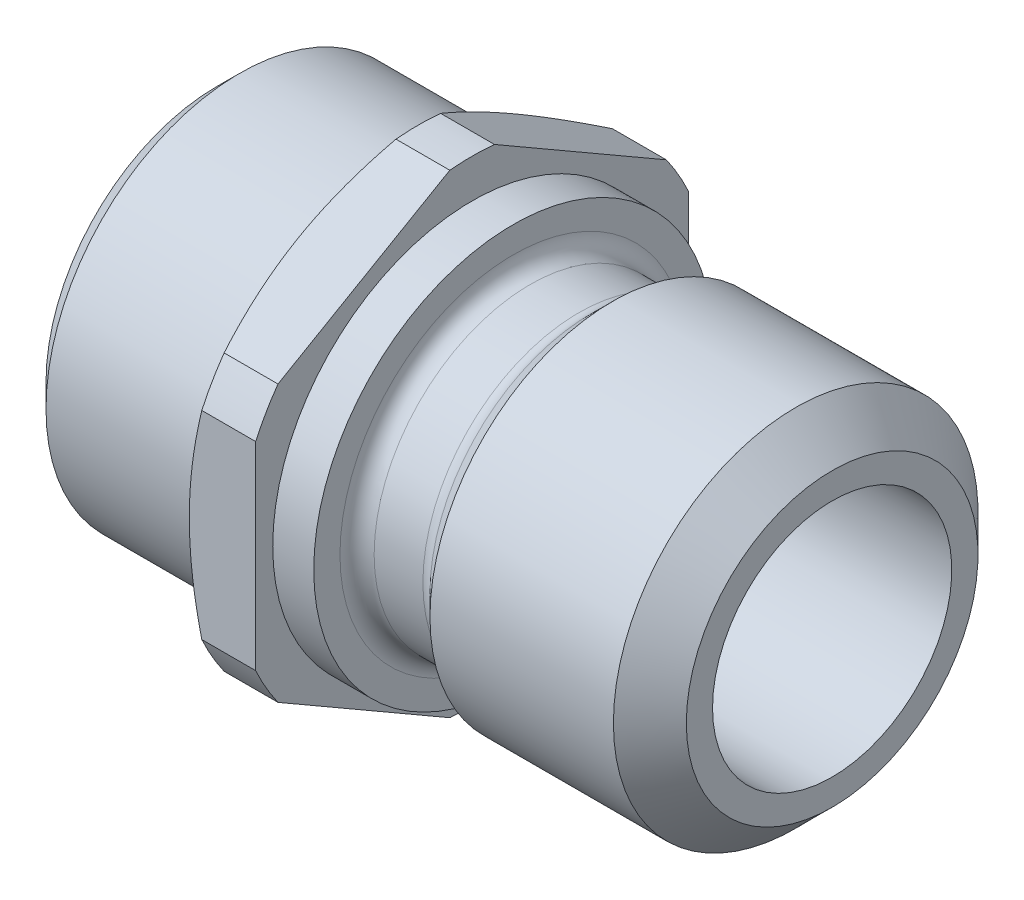
ISO-10303-21;
HEADER;
FILE_DESCRIPTION(('STEP AP214'),'2;1');
FILE_NAME('part.step','',(''),(''),'','','');
FILE_SCHEMA(('AUTOMOTIVE_DESIGN { 1 0 10303 214 1 1 1 1 }'));
ENDSEC;
DATA;
#1=APPLICATION_CONTEXT('core data for automotive mechanical design processes');
#2=APPLICATION_PROTOCOL_DEFINITION('international standard','automotive_design',2000,#1);
#3=PRODUCT_CONTEXT('',#1,'mechanical');
#4=PRODUCT('Part','Part','',(#3));
#5=PRODUCT_RELATED_PRODUCT_CATEGORY('part','',(#4));
#6=PRODUCT_DEFINITION_FORMATION('','',#4);
#7=PRODUCT_DEFINITION_CONTEXT('part definition',#1,'design');
#8=PRODUCT_DEFINITION('design','',#6,#7);
#9=PRODUCT_DEFINITION_SHAPE('','',#8);
#10=(LENGTH_UNIT() NAMED_UNIT(*) SI_UNIT(.MILLI.,.METRE.));
#11=(NAMED_UNIT(*) PLANE_ANGLE_UNIT() SI_UNIT($,.RADIAN.));
#12=(NAMED_UNIT(*) SI_UNIT($,.STERADIAN.) SOLID_ANGLE_UNIT());
#13=UNCERTAINTY_MEASURE_WITH_UNIT(LENGTH_MEASURE(1.E-05),#10,'distance_accuracy_value','');
#14=(GEOMETRIC_REPRESENTATION_CONTEXT(3) GLOBAL_UNCERTAINTY_ASSIGNED_CONTEXT((#13)) GLOBAL_UNIT_ASSIGNED_CONTEXT((#10,
#11,#12)) REPRESENTATION_CONTEXT('',''));
#15=CARTESIAN_POINT('',(0.,0.,0.));
#16=DIRECTION('',(0.,0.,1.));
#17=DIRECTION('',(1.,0.,0.));
#18=AXIS2_PLACEMENT_3D('',#15,#16,#17);
#19=CARTESIAN_POINT('',(0.,0.,0.));
#20=DIRECTION('',(-1.,0.,0.));
#21=DIRECTION('',(0.,0.,1.));
#22=AXIS2_PLACEMENT_3D('',#19,#20,#21);
#23=CYLINDRICAL_SURFACE('',#22,10.45);
#24=CARTESIAN_POINT('',(11.2,0.,0.));
#25=DIRECTION('',(1.,0.,0.));
#26=DIRECTION('',(0.,0.,-1.));
#27=AXIS2_PLACEMENT_3D('',#24,#25,#26);
#28=CIRCLE('',#27,10.45);
#29=CARTESIAN_POINT('',(11.2,10.4039647910562,-0.979804381732968));
#30=VERTEX_POINT('',#29);
#31=CARTESIAN_POINT('',(11.2,10.4039647910562,0.979804381732963));
#32=VERTEX_POINT('',#31);
#33=EDGE_CURVE('E56',#30,#32,#28,.T.);
#34=ORIENTED_EDGE('',*,*,#33,.F.);
#35=DIRECTION('',(-1.,0.,0.));
#36=VECTOR('',#35,1.);
#37=CARTESIAN_POINT('',(0.,10.4039647910562,-0.979804381732969));
#38=LINE('',#37,#36);
#39=CARTESIAN_POINT('',(8.83715789032495,10.4039647910562,-0.979804381732968));
#40=VERTEX_POINT('',#39);
#41=EDGE_CURVE('E410',#40,#30,#38,.F.);
#42=ORIENTED_EDGE('',*,*,#41,.F.);
#43=CARTESIAN_POINT('',(8.83715789032495,0.,0.));
#44=DIRECTION('',(1.,0.,0.));
#45=DIRECTION('',(0.,0.,-1.));
#46=AXIS2_PLACEMENT_3D('',#43,#44,#45);
#47=CIRCLE('',#46,10.45);
#48=CARTESIAN_POINT('',(8.83715789032495,10.4039647910562,0.979804381732963));
#49=VERTEX_POINT('',#48);
#50=EDGE_CURVE('E369',#49,#40,#47,.F.);
#51=ORIENTED_EDGE('',*,*,#50,.F.);
#52=DIRECTION('',(-1.,0.,0.));
#53=VECTOR('',#52,1.);
#54=CARTESIAN_POINT('',(0.,10.4039647910562,0.979804381732963));
#55=LINE('',#54,#53);
#56=EDGE_CURVE('E145',#32,#49,#55,.T.);
#57=ORIENTED_EDGE('',*,*,#56,.F.);
#58=EDGE_LOOP('',(#34,#42,#51,#57));
#59=FACE_BOUND('',#58,.T.);
#60=ADVANCED_FACE('F41',(#59),#23,.T.);
#61=CARTESIAN_POINT('',(11.2,0.,0.));
#62=DIRECTION('',(1.,0.,0.));
#63=DIRECTION('',(0.,0.,-1.));
#64=AXIS2_PLACEMENT_3D('',#61,#62,#63);
#65=CIRCLE('',#64,10.45);
#66=CARTESIAN_POINT('',(11.2,6.05051788084815,8.52019561826704));
#67=VERTEX_POINT('',#66);
#68=CARTESIAN_POINT('',(11.2,4.35344691020805,9.5));
#69=VERTEX_POINT('',#68);
#70=EDGE_CURVE('E131',#67,#69,#65,.T.);
#71=ORIENTED_EDGE('',*,*,#70,.F.);
#72=DIRECTION('',(-1.,0.,0.));
#73=VECTOR('',#72,1.);
#74=CARTESIAN_POINT('',(0.,6.05051788084815,8.52019561826704));
#75=LINE('',#74,#73);
#76=CARTESIAN_POINT('',(8.83715789032495,6.05051788084815,8.52019561826704));
#77=VERTEX_POINT('',#76);
#78=EDGE_CURVE('E140',#77,#67,#75,.F.);
#79=ORIENTED_EDGE('',*,*,#78,.F.);
#80=CARTESIAN_POINT('',(8.83715789032495,0.,0.));
#81=DIRECTION('',(1.,0.,0.));
#82=DIRECTION('',(0.,0.,-1.));
#83=AXIS2_PLACEMENT_3D('',#80,#81,#82);
#84=CIRCLE('',#83,10.45);
#85=CARTESIAN_POINT('',(8.83715789032495,4.35344691020805,9.5));
#86=VERTEX_POINT('',#85);
#87=EDGE_CURVE('E63',#86,#77,#84,.F.);
#88=ORIENTED_EDGE('',*,*,#87,.F.);
#89=DIRECTION('',(-1.,0.,0.));
#90=VECTOR('',#89,1.);
#91=CARTESIAN_POINT('',(0.,4.35344691020805,9.5));
#92=LINE('',#91,#90);
#93=EDGE_CURVE('E141',#69,#86,#92,.T.);
#94=ORIENTED_EDGE('',*,*,#93,.F.);
#95=EDGE_LOOP('',(#71,#79,#88,#94));
#96=FACE_BOUND('',#95,.T.);
#97=ADVANCED_FACE('F139',(#96),#23,.T.);
#98=CARTESIAN_POINT('',(11.2,0.,0.));
#99=DIRECTION('',(1.,0.,0.));
#100=DIRECTION('',(0.,0.,-1.));
#101=AXIS2_PLACEMENT_3D('',#98,#99,#100);
#102=CIRCLE('',#101,10.45);
#103=CARTESIAN_POINT('',(11.2,-4.35344691020839,9.5));
#104=VERTEX_POINT('',#103);
#105=CARTESIAN_POINT('',(11.2,-6.05051788084814,8.52019561826705));
#106=VERTEX_POINT('',#105);
#107=EDGE_CURVE('E393',#104,#106,#102,.T.);
#108=ORIENTED_EDGE('',*,*,#107,.F.);
#109=DIRECTION('',(-1.,0.,0.));
#110=VECTOR('',#109,1.);
#111=CARTESIAN_POINT('',(0.,-4.35344691020806,9.5));
#112=LINE('',#111,#110);
#113=CARTESIAN_POINT('',(8.83715789032466,-4.35344691020839,9.5));
#114=VERTEX_POINT('',#113);
#115=EDGE_CURVE('E149',#114,#104,#112,.F.);
#116=ORIENTED_EDGE('',*,*,#115,.F.);
#117=CARTESIAN_POINT('',(8.83715789032495,0.,0.));
#118=DIRECTION('',(1.,0.,0.));
#119=DIRECTION('',(0.,0.,-1.));
#120=AXIS2_PLACEMENT_3D('',#117,#118,#119);
#121=CIRCLE('',#120,10.45);
#122=CARTESIAN_POINT('',(8.83715789032495,-6.05051788084814,8.52019561826704));
#123=VERTEX_POINT('',#122);
#124=EDGE_CURVE('E253',#123,#114,#121,.F.);
#125=ORIENTED_EDGE('',*,*,#124,.F.);
#126=DIRECTION('',(-1.,0.,0.));
#127=VECTOR('',#126,1.);
#128=CARTESIAN_POINT('',(0.,-6.05051788084814,8.52019561826704));
#129=LINE('',#128,#127);
#130=EDGE_CURVE('E392',#106,#123,#129,.T.);
#131=ORIENTED_EDGE('',*,*,#130,.F.);
#132=EDGE_LOOP('',(#108,#116,#125,#131));
#133=FACE_BOUND('',#132,.T.);
#134=ADVANCED_FACE('F289',(#133),#23,.T.);
#135=CARTESIAN_POINT('',(11.2,0.,0.));
#136=DIRECTION('',(1.,0.,0.));
#137=DIRECTION('',(0.,0.,-1.));
#138=AXIS2_PLACEMENT_3D('',#135,#136,#137);
#139=CIRCLE('',#138,10.45);
#140=CARTESIAN_POINT('',(11.2,-10.4039647910562,0.979804381732949));
#141=VERTEX_POINT('',#140);
#142=CARTESIAN_POINT('',(11.2,-10.4039647910562,-0.979804381732964));
#143=VERTEX_POINT('',#142);
#144=EDGE_CURVE('E372',#141,#143,#139,.T.);
#145=ORIENTED_EDGE('',*,*,#144,.F.);
#146=DIRECTION('',(-1.,0.,0.));
#147=VECTOR('',#146,1.);
#148=CARTESIAN_POINT('',(0.,-10.4039647910562,0.979804381732949));
#149=LINE('',#148,#147);
#150=CARTESIAN_POINT('',(8.83715789032495,-10.4039647910562,0.979804381732949));
#151=VERTEX_POINT('',#150);
#152=EDGE_CURVE('E394',#151,#141,#149,.F.);
#153=ORIENTED_EDGE('',*,*,#152,.F.);
#154=CARTESIAN_POINT('',(8.83715789032495,0.,0.));
#155=DIRECTION('',(1.,0.,0.));
#156=DIRECTION('',(0.,0.,-1.));
#157=AXIS2_PLACEMENT_3D('',#154,#155,#156);
#158=CIRCLE('',#157,10.45);
#159=CARTESIAN_POINT('',(8.83715789032495,-10.4039647910562,-0.979804381732963));
#160=VERTEX_POINT('',#159);
#161=EDGE_CURVE('E413',#160,#151,#158,.F.);
#162=ORIENTED_EDGE('',*,*,#161,.F.);
#163=DIRECTION('',(-1.,0.,0.));
#164=VECTOR('',#163,1.);
#165=CARTESIAN_POINT('',(0.,-10.4039647910562,-0.979804381732964));
#166=LINE('',#165,#164);
#167=EDGE_CURVE('E399',#143,#160,#166,.T.);
#168=ORIENTED_EDGE('',*,*,#167,.F.);
#169=EDGE_LOOP('',(#145,#153,#162,#168));
#170=FACE_BOUND('',#169,.T.);
#171=ADVANCED_FACE('F443',(#170),#23,.T.);
#172=CARTESIAN_POINT('',(11.2,0.,0.));
#173=DIRECTION('',(1.,0.,0.));
#174=DIRECTION('',(0.,0.,-1.));
#175=AXIS2_PLACEMENT_3D('',#172,#173,#174);
#176=CIRCLE('',#175,10.45);
#177=CARTESIAN_POINT('',(11.2,-6.05051788084815,-8.52019561826704));
#178=VERTEX_POINT('',#177);
#179=CARTESIAN_POINT('',(11.2,-4.35344691020838,-9.5));
#180=VERTEX_POINT('',#179);
#181=EDGE_CURVE('E437',#178,#180,#176,.T.);
#182=ORIENTED_EDGE('',*,*,#181,.F.);
#183=DIRECTION('',(-1.,0.,0.));
#184=VECTOR('',#183,1.);
#185=CARTESIAN_POINT('',(0.,-6.05051788084815,-8.52019561826704));
#186=LINE('',#185,#184);
#187=CARTESIAN_POINT('',(8.83715789032495,-6.05051788084815,-8.52019561826704));
#188=VERTEX_POINT('',#187);
#189=EDGE_CURVE('E401',#188,#178,#186,.F.);
#190=ORIENTED_EDGE('',*,*,#189,.F.);
#191=CARTESIAN_POINT('',(8.83715789032495,0.,0.));
#192=DIRECTION('',(1.,0.,0.));
#193=DIRECTION('',(0.,0.,-1.));
#194=AXIS2_PLACEMENT_3D('',#191,#192,#193);
#195=CIRCLE('',#194,10.45);
#196=CARTESIAN_POINT('',(8.83715789032465,-4.35344691020838,-9.5));
#197=VERTEX_POINT('',#196);
#198=EDGE_CURVE('E416',#197,#188,#195,.F.);
#199=ORIENTED_EDGE('',*,*,#198,.F.);
#200=DIRECTION('',(-1.,0.,0.));
#201=VECTOR('',#200,1.);
#202=CARTESIAN_POINT('',(0.,-4.35344691020804,-9.5));
#203=LINE('',#202,#201);
#204=EDGE_CURVE('E404',#180,#197,#203,.T.);
#205=ORIENTED_EDGE('',*,*,#204,.F.);
#206=EDGE_LOOP('',(#182,#190,#199,#205));
#207=FACE_BOUND('',#206,.T.);
#208=ADVANCED_FACE('F280',(#207),#23,.T.);
#209=CARTESIAN_POINT('',(11.2,0.,0.));
#210=DIRECTION('',(1.,0.,0.));
#211=DIRECTION('',(0.,0.,-1.));
#212=AXIS2_PLACEMENT_3D('',#209,#210,#211);
#213=CIRCLE('',#212,10.45);
#214=CARTESIAN_POINT('',(11.2,4.35344691020804,-9.5));
#215=VERTEX_POINT('',#214);
#216=CARTESIAN_POINT('',(11.2,6.05051788084815,-8.52019561826703));
#217=VERTEX_POINT('',#216);
#218=EDGE_CURVE('E424',#215,#217,#213,.T.);
#219=ORIENTED_EDGE('',*,*,#218,.F.);
#220=DIRECTION('',(-1.,0.,0.));
#221=VECTOR('',#220,1.);
#222=CARTESIAN_POINT('',(0.,4.35344691020804,-9.5));
#223=LINE('',#222,#221);
#224=CARTESIAN_POINT('',(8.83715789032495,4.35344691020804,-9.5));
#225=VERTEX_POINT('',#224);
#226=EDGE_CURVE('E406',#225,#215,#223,.F.);
#227=ORIENTED_EDGE('',*,*,#226,.F.);
#228=CARTESIAN_POINT('',(8.83715789032495,0.,0.));
#229=DIRECTION('',(1.,0.,0.));
#230=DIRECTION('',(0.,0.,-1.));
#231=AXIS2_PLACEMENT_3D('',#228,#229,#230);
#232=CIRCLE('',#231,10.45);
#233=CARTESIAN_POINT('',(8.83715789032495,6.05051788084815,-8.52019561826703));
#234=VERTEX_POINT('',#233);
#235=EDGE_CURVE('E382',#234,#225,#232,.F.);
#236=ORIENTED_EDGE('',*,*,#235,.F.);
#237=DIRECTION('',(-1.,0.,0.));
#238=VECTOR('',#237,1.);
#239=CARTESIAN_POINT('',(0.,6.05051788084815,-8.52019561826703));
#240=LINE('',#239,#238);
#241=EDGE_CURVE('E409',#217,#234,#240,.T.);
#242=ORIENTED_EDGE('',*,*,#241,.F.);
#243=EDGE_LOOP('',(#219,#227,#236,#242));
#244=FACE_BOUND('',#243,.T.);
#245=ADVANCED_FACE('F275',(#244),#23,.T.);
#246=CARTESIAN_POINT('',(27.,10.9696551146029,0.));
#247=DIRECTION('',(0.,0.866025403784439,-0.5));
#248=DIRECTION('',(0.,0.5,0.866025403784439));
#249=AXIS2_PLACEMENT_3D('',#246,#247,#248);
#250=PLANE('',#249);
#251=ORIENTED_EDGE('',*,*,#41,.T.);
#252=DIRECTION('',(0.,-0.5,-0.866025403784439));
#253=VECTOR('',#252,1.);
#254=CARTESIAN_POINT('',(11.2,10.9696551146029,0.));
#255=LINE('',#254,#253);
#256=EDGE_CURVE('E425',#30,#217,#255,.T.);
#257=ORIENTED_EDGE('',*,*,#256,.T.);
#258=ORIENTED_EDGE('',*,*,#241,.T.);
#259=CARTESIAN_POINT('',(8.83721343791461,6.05040241079431,-8.52039561826704));
#260=CARTESIAN_POINT('',(8.78130752598836,6.16660308278487,-8.31913015050574));
#261=CARTESIAN_POINT('',(8.72890160018437,6.28323858344694,-8.11711153739281));
#262=CARTESIAN_POINT('',(8.63186121008157,6.51734897750982,-7.71162044029593));
#263=CARTESIAN_POINT('',(8.58722905266259,6.63482410934285,-7.50814754333527));
#264=CARTESIAN_POINT('',(8.50649562043556,6.8706493065652,-7.09968632004121));
#265=CARTESIAN_POINT('',(8.47040415720236,6.98900021870154,-6.89469652709895));
#266=CARTESIAN_POINT('',(8.40754027399902,7.22631093928369,-6.48366230186988));
#267=CARTESIAN_POINT('',(8.38076692333464,7.34527068571404,-6.277617976997));
#268=CARTESIAN_POINT('',(8.33755024671181,7.58132241724473,-5.86876438477125));
#269=CARTESIAN_POINT('',(8.32091568920526,7.69840559622127,-5.66597037007219));
#270=CARTESIAN_POINT('',(8.2975472390332,7.93281817105879,-5.25995588052056));
#271=CARTESIAN_POINT('',(8.29081314579958,8.05014756188367,-5.05673541439076));
#272=CARTESIAN_POINT('',(8.28740609012631,8.28475679751206,-4.65038029835749));
#273=CARTESIAN_POINT('',(8.29072571865206,8.40203661513028,-4.44724569554032));
#274=CARTESIAN_POINT('',(8.3073296572061,8.63640953569672,-4.04129988920094));
#275=CARTESIAN_POINT('',(8.32061326069902,8.75350265129386,-3.83848866377017));
#276=CARTESIAN_POINT('',(8.3586400326737,8.99893295038956,-3.4133909160196));
#277=CARTESIAN_POINT('',(8.38439088606164,9.1272310754818,-3.19117204484399));
#278=CARTESIAN_POINT('',(8.44689653444807,9.38316198259074,-2.74788671050412));
#279=CARTESIAN_POINT('',(8.48365236553387,9.51079470080966,-2.52682035784084));
#280=CARTESIAN_POINT('',(8.56776048854812,9.7666310971655,-2.08369872092719));
#281=CARTESIAN_POINT('',(8.61522583902933,9.89482539507275,-1.86165968371122));
#282=CARTESIAN_POINT('',(8.71948038376729,10.1502131430836,-1.41931512852586));
#283=CARTESIAN_POINT('',(8.77626590739831,10.277406966627,-1.19900896373964));
#284=CARTESIAN_POINT('',(8.83721343791461,10.40408026111,-0.979604381732966));
#285=B_SPLINE_CURVE_WITH_KNOTS('',3,(#259,#260,#261,#262,#263,#264,#265,#266,#267,#268,#269,
#270,#271,#272,#273,#274,#275,#276,#277,#278,#279,#280,#281,#282,#283,#284),.UNSPECIFIED.,.F.,
.F.,(4,2,2,2,2,2,2,2,2,2,2,2,4),(0.,0.717106261326527,1.43442496400457,2.1525637668942,
2.87063082139254,3.57469737526868,4.27874966564865,4.98228323487405,5.68576692196095,
6.45916499644672,7.2326359070674,8.01468969739446,8.79643622210647),.UNSPECIFIED.);
#286=EDGE_CURVE('E238',#234,#40,#285,.T.);
#287=ORIENTED_EDGE('',*,*,#286,.T.);
#288=EDGE_LOOP('',(#251,#257,#258,#287));
#289=FACE_BOUND('',#288,.T.);
#290=ADVANCED_FACE('F271',(#289),#250,.T.);
#291=CARTESIAN_POINT('',(27.,5.48482755730145,-9.5));
#292=DIRECTION('',(0.,0.,-1.));
#293=DIRECTION('',(-1.,0.,0.));
#294=AXIS2_PLACEMENT_3D('',#291,#292,#293);
#295=PLANE('',#294);
#296=ORIENTED_EDGE('',*,*,#226,.T.);
#297=DIRECTION('',(0.,-1.,0.));
#298=VECTOR('',#297,1.);
#299=CARTESIAN_POINT('',(11.2,5.48482755730145,-9.5));
#300=LINE('',#299,#298);
#301=EDGE_CURVE('E435',#215,#180,#300,.T.);
#302=ORIENTED_EDGE('',*,*,#301,.T.);
#303=ORIENTED_EDGE('',*,*,#204,.T.);
#304=CARTESIAN_POINT('',(12.0995464742129,-12.9992328214621,-9.5));
#305=CARTESIAN_POINT('',(12.0097464171585,-12.8065813098101,-9.5));
#306=CARTESIAN_POINT('',(11.9205136254968,-12.6136655440469,-9.5));
#307=CARTESIAN_POINT('',(11.7433090322967,-12.2272527408477,-9.5));
#308=CARTESIAN_POINT('',(11.6553372478138,-12.0337556955924,-9.5));
#309=CARTESIAN_POINT('',(11.3934719740346,-11.4522441558293,-9.5));
#310=CARTESIAN_POINT('',(11.2216644162951,-11.0632859134566,-9.5));
#311=CARTESIAN_POINT('',(10.8838821861119,-10.2800341150729,-9.5));
#312=CARTESIAN_POINT('',(10.7179492591235,-9.88572250409203,-9.5));
#313=CARTESIAN_POINT('',(10.3947337955923,-9.09358068006351,-9.5));
#314=CARTESIAN_POINT('',(10.2374507554252,-8.69575067343712,-9.5));
#315=CARTESIAN_POINT('',(9.93358515832042,-7.89559292229277,-9.5));
#316=CARTESIAN_POINT('',(9.78701230061235,-7.49326147224343,-9.5));
#317=CARTESIAN_POINT('',(9.50752756847527,-6.68380291788842,-9.5));
#318=CARTESIAN_POINT('',(9.37461697388036,-6.27667536827504,-9.5));
#319=CARTESIAN_POINT('',(9.12629019442572,-5.45809131334874,-9.5));
#320=CARTESIAN_POINT('',(9.01083409580538,-5.0466470580525,-9.5));
#321=CARTESIAN_POINT('',(8.80124639694947,-4.21839824467654,-9.5));
#322=CARTESIAN_POINT('',(8.70711036954019,-3.80159481847562,-9.5));
#323=CARTESIAN_POINT('',(8.53878439408632,-2.9321881346465,-9.5));
#324=CARTESIAN_POINT('',(8.46655270787129,-2.47919304175795,-9.5));
#325=CARTESIAN_POINT('',(8.38440732879174,-1.7965699066059,-9.5));
#326=CARTESIAN_POINT('',(8.36139119518645,-1.56847545760395,-9.5));
#327=CARTESIAN_POINT('',(8.32454890423239,-1.1115493898491,-9.5));
#328=CARTESIAN_POINT('',(8.31072202609125,-0.882717830329301,-9.5));
#329=CARTESIAN_POINT('',(8.29259620626157,-0.425403364557788,-9.5));
#330=CARTESIAN_POINT('',(8.2882672290769,-0.196921649183438,-9.5));
#331=CARTESIAN_POINT('',(8.2891435329354,0.260020963343509,-9.5));
#332=CARTESIAN_POINT('',(8.2943487013467,0.488481860710155,-9.5));
#333=CARTESIAN_POINT('',(8.31417543088754,0.944945707258984,-9.5));
#334=CARTESIAN_POINT('',(8.3287950414353,1.17294874149208,-9.5));
#335=CARTESIAN_POINT('',(8.36712806033476,1.62819335243467,-9.5));
#336=CARTESIAN_POINT('',(8.39084205412586,1.85543487917292,-9.5));
#337=CARTESIAN_POINT('',(8.46285603220757,2.43799887762425,-9.5));
#338=CARTESIAN_POINT('',(8.51746637904825,2.79255171671626,-9.5));
#339=CARTESIAN_POINT('',(8.64551829841406,3.49824695586364,-9.5));
#340=CARTESIAN_POINT('',(8.7189635796423,3.84938867010054,-9.5));
#341=CARTESIAN_POINT('',(8.88216439648538,4.54866427277825,-9.5));
#342=CARTESIAN_POINT('',(8.97195649791692,4.89678954709179,-9.5));
#343=CARTESIAN_POINT('',(9.16511660602808,5.58919802635257,-9.5));
#344=CARTESIAN_POINT('',(9.26848388054421,5.93348143742116,-9.5));
#345=CARTESIAN_POINT('',(9.48833782174317,6.62432935036751,-9.5));
#346=CARTESIAN_POINT('',(9.60501937490252,6.97083142090083,-9.5));
#347=CARTESIAN_POINT('',(9.84795357638832,7.66047582773158,-9.5));
#348=CARTESIAN_POINT('',(9.97420696706235,8.00361790110802,-9.5));
#349=CARTESIAN_POINT('',(10.2337755180427,8.68485629595352,-9.5));
#350=CARTESIAN_POINT('',(10.3670439491386,9.02297051846725,-9.5));
#351=CARTESIAN_POINT('',(10.6399827892818,9.69649101514693,-9.5));
#352=CARTESIAN_POINT('',(10.779651256238,10.0318980749391,-9.5));
#353=CARTESIAN_POINT('',(10.9218882356006,10.3661831157756,-9.5));
#354=B_SPLINE_CURVE_WITH_KNOTS('',3,(#304,#305,#306,#307,#308,#309,#310,#311,#312,#313,#314,
#315,#316,#317,#318,#319,#320,#321,#322,#323,#324,#325,#326,#327,#328,#329,#330,#331,#332,#333,
#334,#335,#336,#337,#338,#339,#340,#341,#342,#343,#344,#345,#346,#347,#348,#349,#350,#351,#352,
#353),.UNSPECIFIED.,.F.,.F.,(4,2,2,2,2,2,2,2,2,2,2,2,2,2,2,2,2,2,2,2,2,2,2,2,4),(0.,
0.637656420898983,1.27532145813519,2.55090538876409,3.83423366173366,5.11748713590538,
6.40188869068364,7.68641045437004,8.96794892276126,10.2492210315362,11.6240468119757,
12.3116492760261,12.999197799132,13.6845689140796,14.3699319324307,15.0551529958312,
15.7404181768778,16.8159965340668,17.8917868414349,18.970013805859,20.0481826410464,
21.1448749147107,22.2416523299494,23.3318729411822,24.4217648878422),.UNSPECIFIED.);
#355=EDGE_CURVE('E252',#197,#225,#354,.T.);
#356=ORIENTED_EDGE('',*,*,#355,.T.);
#357=EDGE_LOOP('',(#296,#302,#303,#356));
#358=FACE_BOUND('',#357,.T.);
#359=ADVANCED_FACE('F267',(#358),#295,.T.);
#360=CARTESIAN_POINT('',(27.,-5.48482755730145,-9.5));
#361=DIRECTION('',(0.,-0.866025403784439,-0.5));
#362=DIRECTION('',(0.,0.5,-0.866025403784439));
#363=AXIS2_PLACEMENT_3D('',#360,#361,#362);
#364=PLANE('',#363);
#365=ORIENTED_EDGE('',*,*,#189,.T.);
#366=DIRECTION('',(0.,-0.5,0.866025403784439));
#367=VECTOR('',#366,1.);
#368=CARTESIAN_POINT('',(11.2,-5.48482755730145,-9.5));
#369=LINE('',#368,#367);
#370=EDGE_CURVE('E367',#178,#143,#369,.T.);
#371=ORIENTED_EDGE('',*,*,#370,.T.);
#372=ORIENTED_EDGE('',*,*,#167,.T.);
#373=CARTESIAN_POINT('',(8.83721343791461,-10.40408026111,-0.979604381732962));
#374=CARTESIAN_POINT('',(8.78130752598836,-10.2878795891195,-1.18086984949426));
#375=CARTESIAN_POINT('',(8.72890160018437,-10.1712440884574,-1.38288846260719));
#376=CARTESIAN_POINT('',(8.63186121008157,-9.93713369439452,-1.78837955970407));
#377=CARTESIAN_POINT('',(8.58722905266259,-9.81965856256149,-1.99185245666473));
#378=CARTESIAN_POINT('',(8.50649562043556,-9.58383336533914,-2.40031367995879));
#379=CARTESIAN_POINT('',(8.47040415720236,-9.4654824532028,-2.60530347290105));
#380=CARTESIAN_POINT('',(8.40754027399902,-9.22817173262065,-3.01633769813012));
#381=CARTESIAN_POINT('',(8.38076692333464,-9.1092119861903,-3.222382023003));
#382=CARTESIAN_POINT('',(8.33755024671181,-8.87316025465961,-3.63123561522875));
#383=CARTESIAN_POINT('',(8.32091568920526,-8.75607707568307,-3.83402962992781));
#384=CARTESIAN_POINT('',(8.29754723903319,-8.52166450084555,-4.24004411947943));
#385=CARTESIAN_POINT('',(8.29081314579958,-8.40433511002067,-4.44326458560924));
#386=CARTESIAN_POINT('',(8.28740609012631,-8.16972587439228,-4.84961970164251));
#387=CARTESIAN_POINT('',(8.29072571865206,-8.05244605677406,-5.05275430445968));
#388=CARTESIAN_POINT('',(8.3073296572061,-7.81807313620762,-5.45870011079906));
#389=CARTESIAN_POINT('',(8.32061326069902,-7.70098002061048,-5.66151133622983));
#390=CARTESIAN_POINT('',(8.3586400326737,-7.45554972151478,-6.0866090839804));
#391=CARTESIAN_POINT('',(8.38439088606164,-7.32725159642253,-6.30882795515601));
#392=CARTESIAN_POINT('',(8.44689653444807,-7.07132068931359,-6.75211328949588));
#393=CARTESIAN_POINT('',(8.48365236553387,-6.94368797109468,-6.97317964215916));
#394=CARTESIAN_POINT('',(8.56776048854812,-6.68785157473884,-7.41630127907281));
#395=CARTESIAN_POINT('',(8.61522583902933,-6.55965727683159,-7.63834031628878));
#396=CARTESIAN_POINT('',(8.7194803837673,-6.30426952882076,-8.08068487147414));
#397=CARTESIAN_POINT('',(8.77626590739831,-6.1770757052773,-8.30099103626037));
#398=CARTESIAN_POINT('',(8.83721343791461,-6.05040241079431,-8.52039561826704));
#399=B_SPLINE_CURVE_WITH_KNOTS('',3,(#373,#374,#375,#376,#377,#378,#379,#380,#381,#382,#383,
#384,#385,#386,#387,#388,#389,#390,#391,#392,#393,#394,#395,#396,#397,#398),.UNSPECIFIED.,.F.,
.F.,(4,2,2,2,2,2,2,2,2,2,2,2,4),(0.,0.717106261326527,1.43442496400457,2.15256376689421,
2.87063082139254,3.57469737526869,4.27874966564866,4.98228323487405,5.68576692196095,
6.45916499644672,7.23263590706741,8.01468969739447,8.79643622210648),.UNSPECIFIED.);
#400=EDGE_CURVE('E218',#160,#188,#399,.T.);
#401=ORIENTED_EDGE('',*,*,#400,.T.);
#402=EDGE_LOOP('',(#365,#371,#372,#401));
#403=FACE_BOUND('',#402,.T.);
#404=ADVANCED_FACE('F263',(#403),#364,.T.);
#405=CARTESIAN_POINT('',(27.,-10.9696551146029,0.));
#406=DIRECTION('',(0.,-0.866025403784439,0.5));
#407=DIRECTION('',(0.,-0.5,-0.866025403784439));
#408=AXIS2_PLACEMENT_3D('',#405,#406,#407);
#409=PLANE('',#408);
#410=ORIENTED_EDGE('',*,*,#152,.T.);
#411=DIRECTION('',(0.,0.5,0.866025403784439));
#412=VECTOR('',#411,1.);
#413=CARTESIAN_POINT('',(11.2,-10.9696551146029,0.));
#414=LINE('',#413,#412);
#415=EDGE_CURVE('E427',#141,#106,#414,.T.);
#416=ORIENTED_EDGE('',*,*,#415,.T.);
#417=ORIENTED_EDGE('',*,*,#130,.T.);
#418=CARTESIAN_POINT('',(8.83721343791461,-6.0504024107943,8.52039561826705));
#419=CARTESIAN_POINT('',(8.78130752598836,-6.16660308278486,8.31913015050575));
#420=CARTESIAN_POINT('',(8.72890160018437,-6.28323858344693,8.11711153739282));
#421=CARTESIAN_POINT('',(8.63186121008157,-6.51734897750981,7.71162044029594));
#422=CARTESIAN_POINT('',(8.58722905266259,-6.63482410934284,7.50814754333528));
#423=CARTESIAN_POINT('',(8.50649562043556,-6.87064930656519,7.09968632004122));
#424=CARTESIAN_POINT('',(8.47040415720236,-6.98900021870153,6.89469652709896));
#425=CARTESIAN_POINT('',(8.40754027399901,-7.22631093928368,6.48366230186989));
#426=CARTESIAN_POINT('',(8.38076692333464,-7.34527068571403,6.27761797699701));
#427=CARTESIAN_POINT('',(8.33755024671181,-7.58132241724471,5.86876438477126));
#428=CARTESIAN_POINT('',(8.32091568920526,-7.69840559622126,5.6659703700722));
#429=CARTESIAN_POINT('',(8.29754723903319,-7.93281817105878,5.25995588052058));
#430=CARTESIAN_POINT('',(8.29081314579958,-8.05014756188366,5.05673541439077));
#431=CARTESIAN_POINT('',(8.28740609012631,-8.28475679751205,4.6503802983575));
#432=CARTESIAN_POINT('',(8.29072571865205,-8.40203661513027,4.44724569554034));
#433=CARTESIAN_POINT('',(8.3073296572061,-8.63640953569671,4.04129988920096));
#434=CARTESIAN_POINT('',(8.32061326069901,-8.75350265129385,3.83848866377018));
#435=CARTESIAN_POINT('',(8.3586400326737,-8.99893295038954,3.41339091601961));
#436=CARTESIAN_POINT('',(8.38439088606164,-9.12723107548179,3.191172044844));
#437=CARTESIAN_POINT('',(8.44689653444806,-9.38316198259074,2.74788671050412));
#438=CARTESIAN_POINT('',(8.48365236553387,-9.51079470080965,2.52682035784084));
#439=CARTESIAN_POINT('',(8.56776048854811,-9.7666310971655,2.08369872092719));
#440=CARTESIAN_POINT('',(8.61522583902933,-9.89482539507274,1.86165968371121));
#441=CARTESIAN_POINT('',(8.71948038376729,-10.1502131430836,1.41931512852585));
#442=CARTESIAN_POINT('',(8.77626590739831,-10.277406966627,1.19900896373962));
#443=CARTESIAN_POINT('',(8.83721343791461,-10.40408026111,0.979604381732947));
#444=B_SPLINE_CURVE_WITH_KNOTS('',3,(#418,#419,#420,#421,#422,#423,#424,#425,#426,#427,#428,
#429,#430,#431,#432,#433,#434,#435,#436,#437,#438,#439,#440,#441,#442,#443),.UNSPECIFIED.,.F.,
.F.,(4,2,2,2,2,2,2,2,2,2,2,2,4),(0.,0.717106261326528,1.43442496400457,2.15256376689421,
2.87063082139254,3.57469737526869,4.27874966564865,4.98228323487405,5.68576692196095,
6.45916499644673,7.23263590706742,8.01468969739449,8.7964362221065),.UNSPECIFIED.);
#445=EDGE_CURVE('E245',#123,#151,#444,.T.);
#446=ORIENTED_EDGE('',*,*,#445,.T.);
#447=EDGE_LOOP('',(#410,#416,#417,#446));
#448=FACE_BOUND('',#447,.T.);
#449=ADVANCED_FACE('F260',(#448),#409,.T.);
#450=CARTESIAN_POINT('',(27.,-5.48482755730145,9.5));
#451=DIRECTION('',(0.,0.,1.));
#452=DIRECTION('',(0.,-1.,0.));
#453=AXIS2_PLACEMENT_3D('',#450,#451,#452);
#454=PLANE('',#453);
#455=ORIENTED_EDGE('',*,*,#115,.T.);
#456=DIRECTION('',(0.,1.,0.));
#457=VECTOR('',#456,1.);
#458=CARTESIAN_POINT('',(11.2,-5.48482755730145,9.5));
#459=LINE('',#458,#457);
#460=EDGE_CURVE('E429',#104,#69,#459,.T.);
#461=ORIENTED_EDGE('',*,*,#460,.T.);
#462=ORIENTED_EDGE('',*,*,#93,.T.);
#463=CARTESIAN_POINT('',(12.0995464742129,-12.9992328214621,9.49999999999999));
#464=CARTESIAN_POINT('',(12.0097464171585,-12.8065813098101,9.49999999999999));
#465=CARTESIAN_POINT('',(11.9205136254968,-12.613665544047,9.49999999999999));
#466=CARTESIAN_POINT('',(11.7433090322967,-12.2272527408477,9.49999999999999));
#467=CARTESIAN_POINT('',(11.6553372478138,-12.0337556955924,9.49999999999999));
#468=CARTESIAN_POINT('',(11.3934719740346,-11.4522441558294,9.49999999999999));
#469=CARTESIAN_POINT('',(11.2216644162951,-11.0632859134566,9.5));
#470=CARTESIAN_POINT('',(10.8838821861119,-10.2800341150729,9.5));
#471=CARTESIAN_POINT('',(10.7179492591235,-9.88572250409204,9.5));
#472=CARTESIAN_POINT('',(10.3947337955923,-9.09358068006352,9.5));
#473=CARTESIAN_POINT('',(10.2374507554252,-8.69575067343714,9.5));
#474=CARTESIAN_POINT('',(9.93358515832042,-7.89559292229279,9.5));
#475=CARTESIAN_POINT('',(9.78701230061236,-7.49326147224344,9.5));
#476=CARTESIAN_POINT('',(9.50752756847528,-6.68380291788843,9.5));
#477=CARTESIAN_POINT('',(9.37461697388037,-6.27667536827505,9.5));
#478=CARTESIAN_POINT('',(9.12629019442572,-5.45809131334875,9.5));
#479=CARTESIAN_POINT('',(9.01083409580538,-5.04664705805251,9.5));
#480=CARTESIAN_POINT('',(8.80124639694947,-4.21839824467655,9.5));
#481=CARTESIAN_POINT('',(8.70711036954019,-3.80159481847562,9.5));
#482=CARTESIAN_POINT('',(8.53878439408632,-2.93218813464651,9.5));
#483=CARTESIAN_POINT('',(8.46655270787129,-2.47919304175796,9.5));
#484=CARTESIAN_POINT('',(8.38440732879174,-1.79656990660591,9.5));
#485=CARTESIAN_POINT('',(8.36139119518645,-1.56847545760396,9.5));
#486=CARTESIAN_POINT('',(8.32454890423239,-1.11154938984911,9.5));
#487=CARTESIAN_POINT('',(8.31072202609125,-0.882717830329309,9.5));
#488=CARTESIAN_POINT('',(8.29259620626157,-0.425403364557797,9.5));
#489=CARTESIAN_POINT('',(8.2882672290769,-0.196921649183447,9.5));
#490=CARTESIAN_POINT('',(8.2891435329354,0.2600209633435,9.5));
#491=CARTESIAN_POINT('',(8.2943487013467,0.488481860710146,9.5));
#492=CARTESIAN_POINT('',(8.31417543088754,0.944945707258974,9.5));
#493=CARTESIAN_POINT('',(8.3287950414353,1.17294874149207,9.5));
#494=CARTESIAN_POINT('',(8.36712806033475,1.62819335243466,9.5));
#495=CARTESIAN_POINT('',(8.39084205412586,1.85543487917291,9.5));
#496=CARTESIAN_POINT('',(8.46285603220756,2.43799887762424,9.5));
#497=CARTESIAN_POINT('',(8.51746637904824,2.79255171671625,9.5));
#498=CARTESIAN_POINT('',(8.64551829841406,3.49824695586363,9.5));
#499=CARTESIAN_POINT('',(8.71896357964229,3.84938867010053,9.5));
#500=CARTESIAN_POINT('',(8.88216439648537,4.54866427277824,9.5));
#501=CARTESIAN_POINT('',(8.97195649791692,4.89678954709177,9.5));
#502=CARTESIAN_POINT('',(9.16511660602807,5.58919802635256,9.5));
#503=CARTESIAN_POINT('',(9.2684838805442,5.93348143742115,9.5));
#504=CARTESIAN_POINT('',(9.48833782174316,6.62432935036749,9.5));
#505=CARTESIAN_POINT('',(9.60501937490251,6.97083142090081,9.5));
#506=CARTESIAN_POINT('',(9.84795357638831,7.66047582773157,9.5));
#507=CARTESIAN_POINT('',(9.97420696706234,8.003617901108,9.5));
#508=CARTESIAN_POINT('',(10.2337755180427,8.68485629595351,9.5));
#509=CARTESIAN_POINT('',(10.3670439491386,9.02297051846723,9.5));
#510=CARTESIAN_POINT('',(10.6399827892818,9.69649101514691,9.5));
#511=CARTESIAN_POINT('',(10.779651256238,10.0318980749391,9.5));
#512=CARTESIAN_POINT('',(10.9218882356006,10.3661831157756,9.5));
#513=B_SPLINE_CURVE_WITH_KNOTS('',3,(#463,#464,#465,#466,#467,#468,#469,#470,#471,#472,#473,
#474,#475,#476,#477,#478,#479,#480,#481,#482,#483,#484,#485,#486,#487,#488,#489,#490,#491,#492,
#493,#494,#495,#496,#497,#498,#499,#500,#501,#502,#503,#504,#505,#506,#507,#508,#509,#510,#511,
#512),.UNSPECIFIED.,.F.,.F.,(4,2,2,2,2,2,2,2,2,2,2,2,2,2,2,2,2,2,2,2,2,2,2,2,4),(0.,
0.637656420898984,1.27532145813519,2.55090538876409,3.83423366173366,5.11748713590538,
6.40188869068364,7.68641045437004,8.96794892276126,10.2492210315362,11.6240468119757,
12.3116492760262,12.999197799132,13.6845689140796,14.3699319324307,15.0551529958313,
15.7404181768778,16.8159965340669,17.8917868414349,18.970013805859,20.0481826410464,
21.1448749147107,22.2416523299494,23.3318729411822,24.4217648878422),.UNSPECIFIED.);
#514=EDGE_CURVE('E231',#86,#114,#513,.F.);
#515=ORIENTED_EDGE('',*,*,#514,.T.);
#516=EDGE_LOOP('',(#455,#461,#462,#515));
#517=FACE_BOUND('',#516,.T.);
#518=ADVANCED_FACE('F212',(#517),#454,.T.);
#519=CARTESIAN_POINT('',(27.,5.48482755730145,9.5));
#520=DIRECTION('',(0.,0.866025403784439,0.5));
#521=DIRECTION('',(0.,-0.5,0.866025403784439));
#522=AXIS2_PLACEMENT_3D('',#519,#520,#521);
#523=PLANE('',#522);
#524=ORIENTED_EDGE('',*,*,#78,.T.);
#525=DIRECTION('',(0.,0.5,-0.866025403784439));
#526=VECTOR('',#525,1.);
#527=CARTESIAN_POINT('',(11.2,5.48482755730145,9.5));
#528=LINE('',#527,#526);
#529=EDGE_CURVE('E12',#67,#32,#528,.T.);
#530=ORIENTED_EDGE('',*,*,#529,.T.);
#531=ORIENTED_EDGE('',*,*,#56,.T.);
#532=CARTESIAN_POINT('',(8.83721343791461,10.40408026111,0.979604381732962));
#533=CARTESIAN_POINT('',(8.78130752598836,10.2878795891195,1.18086984949426));
#534=CARTESIAN_POINT('',(8.72890160018437,10.1712440884574,1.38288846260719));
#535=CARTESIAN_POINT('',(8.63186121008157,9.93713369439452,1.78837955970407));
#536=CARTESIAN_POINT('',(8.58722905266259,9.81965856256149,1.99185245666473));
#537=CARTESIAN_POINT('',(8.50649562043556,9.58383336533914,2.40031367995879));
#538=CARTESIAN_POINT('',(8.47040415720236,9.4654824532028,2.60530347290105));
#539=CARTESIAN_POINT('',(8.40754027399902,9.22817173262065,3.01633769813012));
#540=CARTESIAN_POINT('',(8.38076692333464,9.1092119861903,3.222382023003));
#541=CARTESIAN_POINT('',(8.33755024671181,8.87316025465961,3.63123561522875));
#542=CARTESIAN_POINT('',(8.32091568920526,8.75607707568307,3.83402962992781));
#543=CARTESIAN_POINT('',(8.29754723903319,8.52166450084555,4.24004411947944));
#544=CARTESIAN_POINT('',(8.29081314579958,8.40433511002067,4.44326458560924));
#545=CARTESIAN_POINT('',(8.28740609012631,8.16972587439228,4.84961970164251));
#546=CARTESIAN_POINT('',(8.29072571865206,8.05244605677406,5.05275430445968));
#547=CARTESIAN_POINT('',(8.3073296572061,7.81807313620762,5.45870011079906));
#548=CARTESIAN_POINT('',(8.32061326069902,7.70098002061048,5.66151133622983));
#549=CARTESIAN_POINT('',(8.3586400326737,7.45554972151478,6.0866090839804));
#550=CARTESIAN_POINT('',(8.38439088606164,7.32725159642254,6.30882795515601));
#551=CARTESIAN_POINT('',(8.44689653444807,7.0713206893136,6.75211328949588));
#552=CARTESIAN_POINT('',(8.48365236553387,6.94368797109468,6.97317964215916));
#553=CARTESIAN_POINT('',(8.56776048854812,6.68785157473884,7.41630127907281));
#554=CARTESIAN_POINT('',(8.61522583902933,6.55965727683159,7.63834031628878));
#555=CARTESIAN_POINT('',(8.7194803837673,6.30426952882076,8.08068487147414));
#556=CARTESIAN_POINT('',(8.77626590739831,6.1770757052773,8.30099103626037));
#557=CARTESIAN_POINT('',(8.83721343791461,6.05040241079431,8.52039561826704));
#558=B_SPLINE_CURVE_WITH_KNOTS('',3,(#532,#533,#534,#535,#536,#537,#538,#539,#540,#541,#542,
#543,#544,#545,#546,#547,#548,#549,#550,#551,#552,#553,#554,#555,#556,#557),.UNSPECIFIED.,.F.,
.F.,(4,2,2,2,2,2,2,2,2,2,2,2,4),(0.,0.717106261326528,1.43442496400457,2.15256376689421,
2.87063082139254,3.57469737526869,4.27874966564865,4.98228323487405,5.68576692196095,
6.45916499644672,7.23263590706741,8.01468969739447,8.79643622210647),.UNSPECIFIED.);
#559=EDGE_CURVE('E49',#49,#77,#558,.T.);
#560=ORIENTED_EDGE('',*,*,#559,.T.);
#561=EDGE_LOOP('',(#524,#530,#531,#560));
#562=FACE_BOUND('',#561,.T.);
#563=ADVANCED_FACE('F144',(#562),#523,.T.);
#564=CARTESIAN_POINT('',(13.,10.45,0.));
#565=DIRECTION('',(-1.,0.,0.));
#566=DIRECTION('',(0.,0.,1.));
#567=AXIS2_PLACEMENT_3D('',#564,#565,#566);
#568=PLANE('',#567);
#569=CARTESIAN_POINT('',(13.,0.,0.));
#570=DIRECTION('',(-1.,0.,0.));
#571=DIRECTION('',(0.,0.,1.));
#572=AXIS2_PLACEMENT_3D('',#569,#570,#571);
#573=CIRCLE('',#572,7.6);
#574=CARTESIAN_POINT('',(13.,0.,7.6));
#575=VERTEX_POINT('',#574);
#576=EDGE_CURVE('E164',#575,#575,#573,.T.);
#577=ORIENTED_EDGE('',*,*,#576,.T.);
#578=EDGE_LOOP('',(#577));
#579=FACE_BOUND('',#578,.T.);
#580=CARTESIAN_POINT('',(13.,0.,0.));
#581=DIRECTION('',(1.,0.,0.));
#582=DIRECTION('',(0.,0.,-1.));
#583=AXIS2_PLACEMENT_3D('',#580,#581,#582);
#584=CIRCLE('',#583,8.75);
#585=CARTESIAN_POINT('',(13.,0.,-8.75));
#586=VERTEX_POINT('',#585);
#587=EDGE_CURVE('E641',#586,#586,#584,.T.);
#588=ORIENTED_EDGE('',*,*,#587,.T.);
#589=EDGE_LOOP('',(#588));
#590=FACE_BOUND('',#589,.T.);
#591=ADVANCED_FACE('F294',(#579,#590),#568,.F.);
#592=CARTESIAN_POINT('',(8.,8.5,0.));
#593=DIRECTION('',(1.,0.,0.));
#594=DIRECTION('',(0.,0.,-1.));
#595=AXIS2_PLACEMENT_3D('',#592,#593,#594);
#596=PLANE('',#595);
#597=CARTESIAN_POINT('',(8.,0.,0.));
#598=DIRECTION('',(-1.,0.,0.));
#599=DIRECTION('',(0.,0.,1.));
#600=AXIS2_PLACEMENT_3D('',#597,#598,#599);
#601=CIRCLE('',#600,8.5);
#602=CARTESIAN_POINT('',(8.,0.,8.5));
#603=VERTEX_POINT('',#602);
#604=EDGE_CURVE('E161',#603,#603,#601,.T.);
#605=ORIENTED_EDGE('',*,*,#604,.F.);
#606=EDGE_LOOP('',(#605));
#607=FACE_BOUND('',#606,.T.);
#608=CARTESIAN_POINT('',(8.,0.,0.));
#609=DIRECTION('',(-1.,0.,0.));
#610=DIRECTION('',(0.,0.,1.));
#611=AXIS2_PLACEMENT_3D('',#608,#609,#610);
#612=CIRCLE('',#611,9.);
#613=CARTESIAN_POINT('',(8.,0.,9.));
#614=VERTEX_POINT('',#613);
#615=EDGE_CURVE('E365',#614,#614,#612,.T.);
#616=ORIENTED_EDGE('',*,*,#615,.T.);
#617=EDGE_LOOP('',(#616));
#618=FACE_BOUND('',#617,.T.);
#619=ADVANCED_FACE('F292',(#607,#618),#596,.F.);
#620=CARTESIAN_POINT('',(0.,0.,0.));
#621=DIRECTION('',(-1.,0.,0.));
#622=DIRECTION('',(0.,0.,1.));
#623=AXIS2_PLACEMENT_3D('',#620,#621,#622);
#624=CYLINDRICAL_SURFACE('',#623,3.);
#625=CARTESIAN_POINT('',(3.,0.,0.));
#626=DIRECTION('',(-1.,0.,0.));
#627=DIRECTION('',(0.,0.,1.));
#628=AXIS2_PLACEMENT_3D('',#625,#626,#627);
#629=CIRCLE('',#628,3.);
#630=CARTESIAN_POINT('',(3.,0.,3.));
#631=VERTEX_POINT('',#630);
#632=EDGE_CURVE('E194',#631,#631,#629,.T.);
#633=ORIENTED_EDGE('',*,*,#632,.F.);
#634=EDGE_LOOP('',(#633));
#635=FACE_BOUND('',#634,.T.);
#636=CARTESIAN_POINT('',(0.,0.,0.));
#637=DIRECTION('',(-1.,0.,0.));
#638=DIRECTION('',(0.,0.,1.));
#639=AXIS2_PLACEMENT_3D('',#636,#637,#638);
#640=CIRCLE('',#639,3.);
#641=CARTESIAN_POINT('',(0.,0.,3.));
#642=VERTEX_POINT('',#641);
#643=EDGE_CURVE('E147',#642,#642,#640,.T.);
#644=ORIENTED_EDGE('',*,*,#643,.T.);
#645=EDGE_LOOP('',(#644));
#646=FACE_BOUND('',#645,.T.);
#647=ADVANCED_FACE('F43',(#635,#646),#624,.F.);
#648=CARTESIAN_POINT('',(3.,4.24999999999999,0.));
#649=DIRECTION('',(-1.,0.,0.));
#650=DIRECTION('',(0.,0.,1.));
#651=AXIS2_PLACEMENT_3D('',#648,#649,#650);
#652=PLANE('',#651);
#653=CARTESIAN_POINT('',(3.,0.,0.));
#654=DIRECTION('',(-1.,0.,0.));
#655=DIRECTION('',(0.,0.,1.));
#656=AXIS2_PLACEMENT_3D('',#653,#654,#655);
#657=CIRCLE('',#656,4.24999999999999);
#658=CARTESIAN_POINT('',(3.,0.,4.24999999999999));
#659=VERTEX_POINT('',#658);
#660=EDGE_CURVE('E191',#659,#659,#657,.T.);
#661=ORIENTED_EDGE('',*,*,#660,.F.);
#662=EDGE_LOOP('',(#661));
#663=FACE_BOUND('',#662,.T.);
#664=ORIENTED_EDGE('',*,*,#632,.T.);
#665=EDGE_LOOP('',(#664));
#666=FACE_BOUND('',#665,.T.);
#667=ADVANCED_FACE('F333',(#663,#666),#652,.F.);
#668=CARTESIAN_POINT('',(4.,0.,0.));
#669=DIRECTION('',(-1.,0.,0.));
#670=DIRECTION('',(0.,0.,1.));
#671=AXIS2_PLACEMENT_3D('',#668,#669,#670);
#672=TOROIDAL_SURFACE('',#671,4.25,1.);
#673=CARTESIAN_POINT('',(4.00000000000001,0.,0.));
#674=DIRECTION('',(-1.,0.,0.));
#675=DIRECTION('',(0.,0.,1.));
#676=AXIS2_PLACEMENT_3D('',#673,#674,#675);
#677=CIRCLE('',#676,5.25);
#678=CARTESIAN_POINT('',(4.00000000000001,0.,5.25));
#679=VERTEX_POINT('',#678);
#680=EDGE_CURVE('E188',#679,#679,#677,.T.);
#681=ORIENTED_EDGE('',*,*,#680,.F.);
#682=EDGE_LOOP('',(#681));
#683=FACE_BOUND('',#682,.T.);
#684=ORIENTED_EDGE('',*,*,#660,.T.);
#685=EDGE_LOOP('',(#684));
#686=FACE_BOUND('',#685,.T.);
#687=ADVANCED_FACE('F330',(#683,#686),#672,.F.);
#688=CARTESIAN_POINT('',(0.,0.,0.));
#689=DIRECTION('',(-1.,0.,0.));
#690=DIRECTION('',(0.,0.,1.));
#691=AXIS2_PLACEMENT_3D('',#688,#689,#690);
#692=CYLINDRICAL_SURFACE('',#691,5.24999999999999);
#693=CARTESIAN_POINT('',(27.,0.,0.));
#694=DIRECTION('',(-1.,0.,0.));
#695=DIRECTION('',(0.,0.,1.));
#696=AXIS2_PLACEMENT_3D('',#693,#694,#695);
#697=CIRCLE('',#696,5.24999999999999);
#698=CARTESIAN_POINT('',(27.,0.,5.24999999999999));
#699=VERTEX_POINT('',#698);
#700=EDGE_CURVE('E185',#699,#699,#697,.T.);
#701=ORIENTED_EDGE('',*,*,#700,.F.);
#702=EDGE_LOOP('',(#701));
#703=FACE_BOUND('',#702,.T.);
#704=ORIENTED_EDGE('',*,*,#680,.T.);
#705=EDGE_LOOP('',(#704));
#706=FACE_BOUND('',#705,.T.);
#707=ADVANCED_FACE('F326',(#703,#706),#692,.F.);
#708=CARTESIAN_POINT('',(27.,6.40000000000001,0.));
#709=DIRECTION('',(-1.,0.,0.));
#710=DIRECTION('',(0.,0.,1.));
#711=AXIS2_PLACEMENT_3D('',#708,#709,#710);
#712=PLANE('',#711);
#713=CARTESIAN_POINT('',(27.,0.,0.));
#714=DIRECTION('',(-1.,0.,0.));
#715=DIRECTION('',(0.,0.,1.));
#716=AXIS2_PLACEMENT_3D('',#713,#714,#715);
#717=CIRCLE('',#716,6.40000000000001);
#718=CARTESIAN_POINT('',(27.,0.,6.40000000000001));
#719=VERTEX_POINT('',#718);
#720=EDGE_CURVE('E182',#719,#719,#717,.T.);
#721=ORIENTED_EDGE('',*,*,#720,.F.);
#722=EDGE_LOOP('',(#721));
#723=FACE_BOUND('',#722,.T.);
#724=ORIENTED_EDGE('',*,*,#700,.T.);
#725=EDGE_LOOP('',(#724));
#726=FACE_BOUND('',#725,.T.);
#727=ADVANCED_FACE('F322',(#723,#726),#712,.F.);
#728=CARTESIAN_POINT('',(27.,0.,0.));
#729=DIRECTION('',(-1.,0.,0.));
#730=DIRECTION('',(0.,0.,1.));
#731=AXIS2_PLACEMENT_3D('',#728,#729,#730);
#732=CONICAL_SURFACE('',#731,6.40000000000001,0.785398163397444);
#733=CARTESIAN_POINT('',(25.4,0.,0.));
#734=DIRECTION('',(-1.,0.,0.));
#735=DIRECTION('',(0.,0.,1.));
#736=AXIS2_PLACEMENT_3D('',#733,#734,#735);
#737=CIRCLE('',#736,8.);
#738=CARTESIAN_POINT('',(25.4,0.,8.));
#739=VERTEX_POINT('',#738);
#740=EDGE_CURVE('E179',#739,#739,#737,.T.);
#741=ORIENTED_EDGE('',*,*,#740,.F.);
#742=EDGE_LOOP('',(#741));
#743=FACE_BOUND('',#742,.T.);
#744=ORIENTED_EDGE('',*,*,#720,.T.);
#745=EDGE_LOOP('',(#744));
#746=FACE_BOUND('',#745,.T.);
#747=ADVANCED_FACE('F318',(#743,#746),#732,.T.);
#748=CARTESIAN_POINT('',(0.,0.,0.));
#749=DIRECTION('',(-1.,0.,0.));
#750=DIRECTION('',(0.,0.,1.));
#751=AXIS2_PLACEMENT_3D('',#748,#749,#750);
#752=CYLINDRICAL_SURFACE('',#751,8.);
#753=CARTESIAN_POINT('',(17.35,0.,0.));
#754=DIRECTION('',(-1.,0.,0.));
#755=DIRECTION('',(0.,0.,1.));
#756=AXIS2_PLACEMENT_3D('',#753,#754,#755);
#757=CIRCLE('',#756,8.);
#758=CARTESIAN_POINT('',(17.35,0.,8.));
#759=VERTEX_POINT('',#758);
#760=EDGE_CURVE('E176',#759,#759,#757,.T.);
#761=ORIENTED_EDGE('',*,*,#760,.F.);
#762=EDGE_LOOP('',(#761));
#763=FACE_BOUND('',#762,.T.);
#764=ORIENTED_EDGE('',*,*,#740,.T.);
#765=EDGE_LOOP('',(#764));
#766=FACE_BOUND('',#765,.T.);
#767=ADVANCED_FACE('F314',(#763,#766),#752,.T.);
#768=CARTESIAN_POINT('',(17.35,0.,0.));
#769=DIRECTION('',(1.,0.,0.));
#770=DIRECTION('',(0.,0.,-1.));
#771=AXIS2_PLACEMENT_3D('',#768,#769,#770);
#772=CONICAL_SURFACE('',#771,8.,0.785398163397453);
#773=CARTESIAN_POINT('',(16.4196699141101,0.,0.));
#774=DIRECTION('',(-1.,0.,0.));
#775=DIRECTION('',(0.,0.,1.));
#776=AXIS2_PLACEMENT_3D('',#773,#774,#775);
#777=CIRCLE('',#776,7.06966991411009);
#778=CARTESIAN_POINT('',(16.4196699141101,0.,7.06966991411009));
#779=VERTEX_POINT('',#778);
#780=EDGE_CURVE('E173',#779,#779,#777,.T.);
#781=ORIENTED_EDGE('',*,*,#780,.F.);
#782=EDGE_LOOP('',(#781));
#783=FACE_BOUND('',#782,.T.);
#784=ORIENTED_EDGE('',*,*,#760,.T.);
#785=EDGE_LOOP('',(#784));
#786=FACE_BOUND('',#785,.T.);
#787=ADVANCED_FACE('F310',(#783,#786),#772,.T.);
#788=CARTESIAN_POINT('',(15.8893398282202,0.,0.));
#789=DIRECTION('',(-1.,0.,0.));
#790=DIRECTION('',(0.,0.,1.));
#791=AXIS2_PLACEMENT_3D('',#788,#789,#790);
#792=TOROIDAL_SURFACE('',#791,7.6,0.75);
#793=CARTESIAN_POINT('',(15.8893398282202,0.,0.));
#794=DIRECTION('',(-1.,0.,0.));
#795=DIRECTION('',(0.,0.,1.));
#796=AXIS2_PLACEMENT_3D('',#793,#794,#795);
#797=CIRCLE('',#796,6.85);
#798=CARTESIAN_POINT('',(15.8893398282202,0.,6.85));
#799=VERTEX_POINT('',#798);
#800=EDGE_CURVE('E170',#799,#799,#797,.T.);
#801=ORIENTED_EDGE('',*,*,#800,.F.);
#802=EDGE_LOOP('',(#801));
#803=FACE_BOUND('',#802,.T.);
#804=ORIENTED_EDGE('',*,*,#780,.T.);
#805=EDGE_LOOP('',(#804));
#806=FACE_BOUND('',#805,.T.);
#807=ADVANCED_FACE('F306',(#803,#806),#792,.F.);
#808=CARTESIAN_POINT('',(0.,0.,0.));
#809=DIRECTION('',(-1.,0.,0.));
#810=DIRECTION('',(0.,0.,1.));
#811=AXIS2_PLACEMENT_3D('',#808,#809,#810);
#812=CYLINDRICAL_SURFACE('',#811,6.85);
#813=CARTESIAN_POINT('',(13.75,0.,0.));
#814=DIRECTION('',(-1.,0.,0.));
#815=DIRECTION('',(0.,0.,1.));
#816=AXIS2_PLACEMENT_3D('',#813,#814,#815);
#817=CIRCLE('',#816,6.85);
#818=CARTESIAN_POINT('',(13.75,0.,6.85));
#819=VERTEX_POINT('',#818);
#820=EDGE_CURVE('E167',#819,#819,#817,.T.);
#821=ORIENTED_EDGE('',*,*,#820,.F.);
#822=EDGE_LOOP('',(#821));
#823=FACE_BOUND('',#822,.T.);
#824=ORIENTED_EDGE('',*,*,#800,.T.);
#825=EDGE_LOOP('',(#824));
#826=FACE_BOUND('',#825,.T.);
#827=ADVANCED_FACE('F302',(#823,#826),#812,.T.);
#828=CARTESIAN_POINT('',(13.75,0.,0.));
#829=DIRECTION('',(-1.,0.,0.));
#830=DIRECTION('',(0.,0.,1.));
#831=AXIS2_PLACEMENT_3D('',#828,#829,#830);
#832=TOROIDAL_SURFACE('',#831,7.6,0.75);
#833=ORIENTED_EDGE('',*,*,#576,.F.);
#834=EDGE_LOOP('',(#833));
#835=FACE_BOUND('',#834,.T.);
#836=ORIENTED_EDGE('',*,*,#820,.T.);
#837=EDGE_LOOP('',(#836));
#838=FACE_BOUND('',#837,.T.);
#839=ADVANCED_FACE('F298',(#835,#838),#832,.F.);
#840=CARTESIAN_POINT('',(0.,0.,0.));
#841=DIRECTION('',(-1.,0.,0.));
#842=DIRECTION('',(0.,0.,1.));
#843=AXIS2_PLACEMENT_3D('',#840,#841,#842);
#844=CYLINDRICAL_SURFACE('',#843,8.5);
#845=CARTESIAN_POINT('',(0.999999999999997,0.,0.));
#846=DIRECTION('',(-1.,0.,0.));
#847=DIRECTION('',(0.,0.,1.));
#848=AXIS2_PLACEMENT_3D('',#845,#846,#847);
#849=CIRCLE('',#848,8.5);
#850=CARTESIAN_POINT('',(0.999999999999997,0.,8.5));
#851=VERTEX_POINT('',#850);
#852=EDGE_CURVE('E158',#851,#851,#849,.T.);
#853=ORIENTED_EDGE('',*,*,#852,.F.);
#854=EDGE_LOOP('',(#853));
#855=FACE_BOUND('',#854,.T.);
#856=ORIENTED_EDGE('',*,*,#604,.T.);
#857=EDGE_LOOP('',(#856));
#858=FACE_BOUND('',#857,.T.);
#859=ADVANCED_FACE('F301',(#855,#858),#844,.T.);
#860=CARTESIAN_POINT('',(0.999999999999997,0.,0.));
#861=DIRECTION('',(1.,0.,0.));
#862=DIRECTION('',(0.,0.,-1.));
#863=AXIS2_PLACEMENT_3D('',#860,#861,#862);
#864=CONICAL_SURFACE('',#863,8.5,0.78539816339745);
#865=CARTESIAN_POINT('',(0.,0.,0.));
#866=DIRECTION('',(-1.,0.,0.));
#867=DIRECTION('',(0.,0.,1.));
#868=AXIS2_PLACEMENT_3D('',#865,#866,#867);
#869=CIRCLE('',#868,7.5);
#870=CARTESIAN_POINT('',(0.,0.,7.5));
#871=VERTEX_POINT('',#870);
#872=EDGE_CURVE('E155',#871,#871,#869,.T.);
#873=ORIENTED_EDGE('',*,*,#872,.F.);
#874=EDGE_LOOP('',(#873));
#875=FACE_BOUND('',#874,.T.);
#876=ORIENTED_EDGE('',*,*,#852,.T.);
#877=EDGE_LOOP('',(#876));
#878=FACE_BOUND('',#877,.T.);
#879=ADVANCED_FACE('F349',(#875,#878),#864,.T.);
#880=CARTESIAN_POINT('',(0.,3.,0.));
#881=DIRECTION('',(1.,0.,0.));
#882=DIRECTION('',(0.,0.,-1.));
#883=AXIS2_PLACEMENT_3D('',#880,#881,#882);
#884=PLANE('',#883);
#885=ORIENTED_EDGE('',*,*,#643,.F.);
#886=EDGE_LOOP('',(#885));
#887=FACE_BOUND('',#886,.T.);
#888=ORIENTED_EDGE('',*,*,#872,.T.);
#889=EDGE_LOOP('',(#888));
#890=FACE_BOUND('',#889,.T.);
#891=ADVANCED_FACE('F210',(#887,#890),#884,.F.);
#892=CARTESIAN_POINT('',(8.,0.,0.));
#893=DIRECTION('',(1.,0.,0.));
#894=DIRECTION('',(0.,0.,1.));
#895=AXIS2_PLACEMENT_3D('',#892,#893,#894);
#896=CONICAL_SURFACE('',#895,9.,1.0471975511966);
#897=ORIENTED_EDGE('',*,*,#161,.T.);
#898=ORIENTED_EDGE('',*,*,#445,.F.);
#899=ORIENTED_EDGE('',*,*,#124,.T.);
#900=ORIENTED_EDGE('',*,*,#514,.F.);
#901=ORIENTED_EDGE('',*,*,#87,.T.);
#902=ORIENTED_EDGE('',*,*,#559,.F.);
#903=ORIENTED_EDGE('',*,*,#50,.T.);
#904=ORIENTED_EDGE('',*,*,#286,.F.);
#905=ORIENTED_EDGE('',*,*,#235,.T.);
#906=ORIENTED_EDGE('',*,*,#355,.F.);
#907=ORIENTED_EDGE('',*,*,#198,.T.);
#908=ORIENTED_EDGE('',*,*,#400,.F.);
#909=EDGE_LOOP('',(#897,#898,#899,#900,#901,#902,#903,#904,#905,#906,#907,#908));
#910=FACE_BOUND('',#909,.T.);
#911=ORIENTED_EDGE('',*,*,#615,.F.);
#912=EDGE_LOOP('',(#911));
#913=FACE_BOUND('',#912,.T.);
#914=ADVANCED_FACE('F205',(#910,#913),#896,.T.);
#915=CARTESIAN_POINT('',(11.2,0.,0.));
#916=DIRECTION('',(1.,0.,0.));
#917=DIRECTION('',(0.,0.,-1.));
#918=AXIS2_PLACEMENT_3D('',#915,#916,#917);
#919=PLANE('',#918);
#920=ORIENTED_EDGE('',*,*,#181,.T.);
#921=ORIENTED_EDGE('',*,*,#301,.F.);
#922=ORIENTED_EDGE('',*,*,#218,.T.);
#923=ORIENTED_EDGE('',*,*,#256,.F.);
#924=ORIENTED_EDGE('',*,*,#33,.T.);
#925=ORIENTED_EDGE('',*,*,#529,.F.);
#926=ORIENTED_EDGE('',*,*,#70,.T.);
#927=ORIENTED_EDGE('',*,*,#460,.F.);
#928=ORIENTED_EDGE('',*,*,#107,.T.);
#929=ORIENTED_EDGE('',*,*,#415,.F.);
#930=ORIENTED_EDGE('',*,*,#144,.T.);
#931=ORIENTED_EDGE('',*,*,#370,.F.);
#932=EDGE_LOOP('',(#920,#921,#922,#923,#924,#925,#926,#927,#928,#929,#930,#931));
#933=FACE_BOUND('',#932,.T.);
#934=CARTESIAN_POINT('',(11.2,0.,0.));
#935=DIRECTION('',(1.,0.,0.));
#936=DIRECTION('',(0.,0.,-1.));
#937=AXIS2_PLACEMENT_3D('',#934,#935,#936);
#938=CIRCLE('',#937,8.75);
#939=CARTESIAN_POINT('',(11.2,0.,-8.75));
#940=VERTEX_POINT('',#939);
#941=EDGE_CURVE('E142',#940,#940,#938,.T.);
#942=ORIENTED_EDGE('',*,*,#941,.F.);
#943=EDGE_LOOP('',(#942));
#944=FACE_BOUND('',#943,.T.);
#945=ADVANCED_FACE('F129',(#933,#944),#919,.T.);
#946=CARTESIAN_POINT('',(11.2,0.,0.));
#947=DIRECTION('',(1.,0.,0.));
#948=DIRECTION('',(0.,0.,-1.));
#949=AXIS2_PLACEMENT_3D('',#946,#947,#948);
#950=CYLINDRICAL_SURFACE('',#949,8.75);
#951=ORIENTED_EDGE('',*,*,#941,.T.);
#952=EDGE_LOOP('',(#951));
#953=FACE_BOUND('',#952,.T.);
#954=ORIENTED_EDGE('',*,*,#587,.F.);
#955=EDGE_LOOP('',(#954));
#956=FACE_BOUND('',#955,.T.);
#957=ADVANCED_FACE('F625',(#953,#956),#950,.T.);
#958=CLOSED_SHELL('',(#60,#97,#134,#171,#208,#245,#290,#359,#404,#449,#518,#563,#591,#619,#647,
#667,#687,#707,#727,#747,#767,#787,#807,#827,#839,#859,#879,#891,#914,#945,#957));
#959=MANIFOLD_SOLID_BREP('B2',#958);
#960=ADVANCED_BREP_SHAPE_REPRESENTATION('',(#18,#959),#14);
#961=SHAPE_DEFINITION_REPRESENTATION(#9,#960);
ENDSEC;
END-ISO-10303-21;
